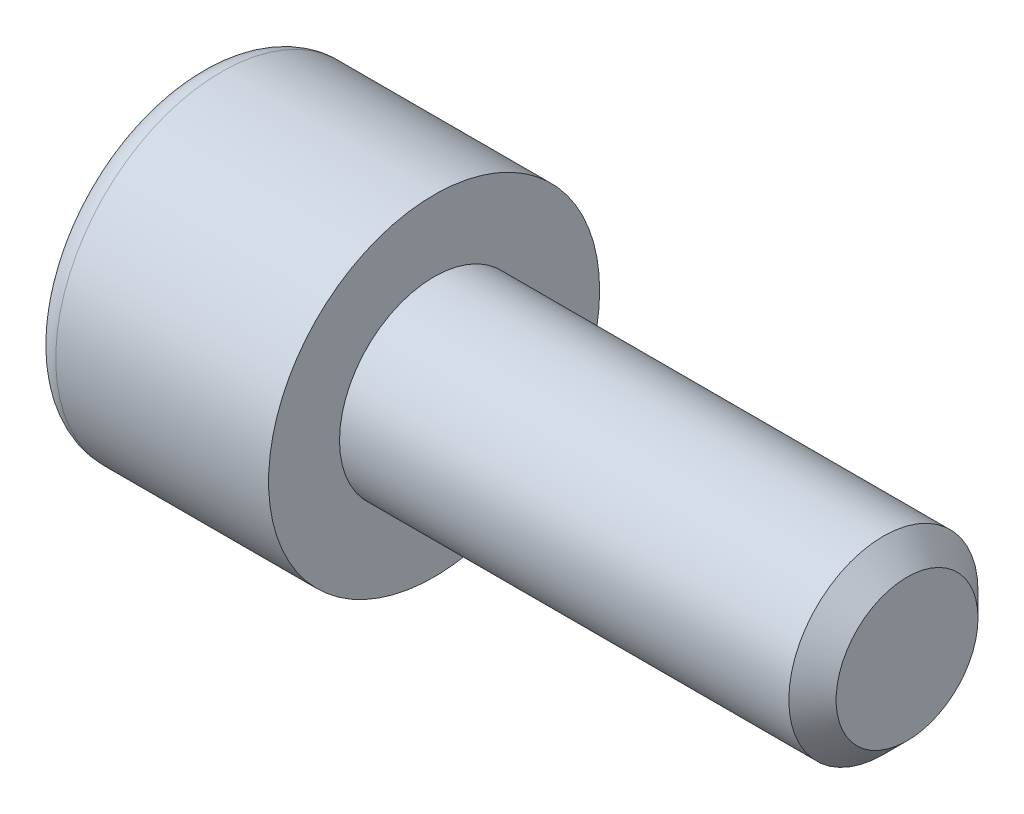
ISO-10303-21;
HEADER;
FILE_DESCRIPTION(('STEP AP214'),'2;1');
FILE_NAME('part.step','',(''),(''),'','','');
FILE_SCHEMA(('AUTOMOTIVE_DESIGN { 1 0 10303 214 1 1 1 1 }'));
ENDSEC;
DATA;
#1=APPLICATION_CONTEXT('core data for automotive mechanical design processes');
#2=APPLICATION_PROTOCOL_DEFINITION('international standard','automotive_design',2000,#1);
#3=PRODUCT_CONTEXT('',#1,'mechanical');
#4=PRODUCT('Part','Part','',(#3));
#5=PRODUCT_RELATED_PRODUCT_CATEGORY('part','',(#4));
#6=PRODUCT_DEFINITION_FORMATION('','',#4);
#7=PRODUCT_DEFINITION_CONTEXT('part definition',#1,'design');
#8=PRODUCT_DEFINITION('design','',#6,#7);
#9=PRODUCT_DEFINITION_SHAPE('','',#8);
#10=(LENGTH_UNIT() NAMED_UNIT(*) SI_UNIT(.MILLI.,.METRE.));
#11=(NAMED_UNIT(*) PLANE_ANGLE_UNIT() SI_UNIT($,.RADIAN.));
#12=(NAMED_UNIT(*) SI_UNIT($,.STERADIAN.) SOLID_ANGLE_UNIT());
#13=UNCERTAINTY_MEASURE_WITH_UNIT(LENGTH_MEASURE(1.E-05),#10,'distance_accuracy_value','');
#14=(GEOMETRIC_REPRESENTATION_CONTEXT(3) GLOBAL_UNCERTAINTY_ASSIGNED_CONTEXT((#13)) GLOBAL_UNIT_ASSIGNED_CONTEXT((#10,
#11,#12)) REPRESENTATION_CONTEXT('',''));
#15=CARTESIAN_POINT('',(0.,0.,0.));
#16=DIRECTION('',(0.,0.,1.));
#17=DIRECTION('',(1.,0.,0.));
#18=AXIS2_PLACEMENT_3D('',#15,#16,#17);
#19=CARTESIAN_POINT('',(5.,0.,0.));
#20=DIRECTION('',(1.,0.,0.));
#21=DIRECTION('',(0.,0.,-1.));
#22=AXIS2_PLACEMENT_3D('',#19,#20,#21);
#23=PLANE('',#22);
#24=CARTESIAN_POINT('',(5.,0.,0.));
#25=DIRECTION('',(1.,0.,0.));
#26=DIRECTION('',(0.,0.,-1.));
#27=AXIS2_PLACEMENT_3D('',#24,#25,#26);
#28=CIRCLE('',#27,3.5);
#29=CARTESIAN_POINT('',(5.,0.,-3.5));
#30=VERTEX_POINT('',#29);
#31=EDGE_CURVE('E144',#30,#30,#28,.T.);
#32=ORIENTED_EDGE('',*,*,#31,.T.);
#33=EDGE_LOOP('',(#32));
#34=FACE_BOUND('',#33,.T.);
#35=CARTESIAN_POINT('',(5.,0.,0.));
#36=DIRECTION('',(1.,0.,0.));
#37=DIRECTION('',(0.,0.,-1.));
#38=AXIS2_PLACEMENT_3D('',#35,#36,#37);
#39=CIRCLE('',#38,2.);
#40=CARTESIAN_POINT('',(5.,0.,-2.));
#41=VERTEX_POINT('',#40);
#42=EDGE_CURVE('E135',#41,#41,#39,.T.);
#43=ORIENTED_EDGE('',*,*,#42,.F.);
#44=EDGE_LOOP('',(#43));
#45=FACE_BOUND('',#44,.T.);
#46=ADVANCED_FACE('F29',(#34,#45),#23,.T.);
#47=CARTESIAN_POINT('',(5.,0.,0.));
#48=DIRECTION('',(-1.,0.,0.));
#49=DIRECTION('',(0.,0.,1.));
#50=AXIS2_PLACEMENT_3D('',#47,#48,#49);
#51=CYLINDRICAL_SURFACE('',#50,3.5);
#52=CARTESIAN_POINT('',(0.5,0.,0.));
#53=DIRECTION('',(1.,0.,0.));
#54=DIRECTION('',(0.,0.,-1.));
#55=AXIS2_PLACEMENT_3D('',#52,#53,#54);
#56=CIRCLE('',#55,3.5);
#57=CARTESIAN_POINT('',(0.5,0.,-3.5));
#58=VERTEX_POINT('',#57);
#59=EDGE_CURVE('E37',#58,#58,#56,.T.);
#60=ORIENTED_EDGE('',*,*,#59,.T.);
#61=EDGE_LOOP('',(#60));
#62=FACE_BOUND('',#61,.T.);
#63=ORIENTED_EDGE('',*,*,#31,.F.);
#64=EDGE_LOOP('',(#63));
#65=FACE_BOUND('',#64,.T.);
#66=ADVANCED_FACE('F31',(#62,#65),#51,.T.);
#67=CARTESIAN_POINT('',(0.,0.,0.));
#68=DIRECTION('',(1.,0.,0.));
#69=DIRECTION('',(0.,0.,-1.));
#70=AXIS2_PLACEMENT_3D('',#67,#68,#69);
#71=PLANE('',#70);
#72=CARTESIAN_POINT('',(0.,0.,0.));
#73=DIRECTION('',(1.,0.,0.));
#74=DIRECTION('',(0.,0.,-1.));
#75=AXIS2_PLACEMENT_3D('',#72,#73,#74);
#76=CIRCLE('',#75,3.);
#77=CARTESIAN_POINT('',(0.,0.,-3.));
#78=VERTEX_POINT('',#77);
#79=EDGE_CURVE('E11',#78,#78,#76,.F.);
#80=ORIENTED_EDGE('',*,*,#79,.T.);
#81=EDGE_LOOP('',(#80));
#82=FACE_BOUND('',#81,.T.);
#83=DIRECTION('',(0.,-0.499999999999998,-0.86602540378444));
#84=VECTOR('',#83,1.);
#85=CARTESIAN_POINT('',(0.,1.73205080756888,0.));
#86=LINE('',#85,#84);
#87=CARTESIAN_POINT('',(0.,1.73205080756888,0.));
#88=VERTEX_POINT('',#87);
#89=CARTESIAN_POINT('',(0.,0.866025403784449,-1.5));
#90=VERTEX_POINT('',#89);
#91=EDGE_CURVE('E111',#88,#90,#86,.T.);
#92=ORIENTED_EDGE('',*,*,#91,.F.);
#93=DIRECTION('',(0.,0.499999999999998,-0.866025403784439));
#94=VECTOR('',#93,1.);
#95=CARTESIAN_POINT('',(0.,0.866025403784447,1.5));
#96=LINE('',#95,#94);
#97=CARTESIAN_POINT('',(0.,0.866025403784447,1.5));
#98=VERTEX_POINT('',#97);
#99=EDGE_CURVE('E117',#98,#88,#96,.T.);
#100=ORIENTED_EDGE('',*,*,#99,.F.);
#101=DIRECTION('',(0.,1.,0.));
#102=VECTOR('',#101,1.);
#103=CARTESIAN_POINT('',(0.,-0.866025403784447,1.5));
#104=LINE('',#103,#102);
#105=CARTESIAN_POINT('',(0.,-0.866025403784447,1.5));
#106=VERTEX_POINT('',#105);
#107=EDGE_CURVE('E130',#106,#98,#104,.T.);
#108=ORIENTED_EDGE('',*,*,#107,.F.);
#109=DIRECTION('',(0.,0.499999999999998,0.866025403784439));
#110=VECTOR('',#109,1.);
#111=CARTESIAN_POINT('',(0.,-1.73205080756888,0.));
#112=LINE('',#111,#110);
#113=CARTESIAN_POINT('',(0.,-1.73205080756888,0.));
#114=VERTEX_POINT('',#113);
#115=EDGE_CURVE('E124',#114,#106,#112,.T.);
#116=ORIENTED_EDGE('',*,*,#115,.F.);
#117=DIRECTION('',(0.,-0.499999999999998,0.86602540378444));
#118=VECTOR('',#117,1.);
#119=CARTESIAN_POINT('',(0.,-0.866025403784449,-1.5));
#120=LINE('',#119,#118);
#121=CARTESIAN_POINT('',(0.,-0.866025403784449,-1.5));
#122=VERTEX_POINT('',#121);
#123=EDGE_CURVE('E122',#122,#114,#120,.T.);
#124=ORIENTED_EDGE('',*,*,#123,.F.);
#125=DIRECTION('',(0.,-1.,0.));
#126=VECTOR('',#125,1.);
#127=CARTESIAN_POINT('',(0.,0.866025403784449,-1.5));
#128=LINE('',#127,#126);
#129=EDGE_CURVE('E103',#90,#122,#128,.T.);
#130=ORIENTED_EDGE('',*,*,#129,.F.);
#131=EDGE_LOOP('',(#92,#100,#108,#116,#124,#130));
#132=FACE_BOUND('',#131,.T.);
#133=ADVANCED_FACE('F119',(#82,#132),#71,.F.);
#134=CARTESIAN_POINT('',(15.,0.,0.));
#135=DIRECTION('',(-1.,0.,0.));
#136=DIRECTION('',(0.,0.,1.));
#137=AXIS2_PLACEMENT_3D('',#134,#135,#136);
#138=CYLINDRICAL_SURFACE('',#137,2.);
#139=CARTESIAN_POINT('',(14.5,0.,0.));
#140=DIRECTION('',(1.,0.,0.));
#141=DIRECTION('',(0.,0.,-1.));
#142=AXIS2_PLACEMENT_3D('',#139,#140,#141);
#143=CIRCLE('',#142,2.);
#144=CARTESIAN_POINT('',(14.5,0.,-2.));
#145=VERTEX_POINT('',#144);
#146=EDGE_CURVE('E150',#145,#145,#143,.F.);
#147=ORIENTED_EDGE('',*,*,#146,.T.);
#148=EDGE_LOOP('',(#147));
#149=FACE_BOUND('',#148,.T.);
#150=ORIENTED_EDGE('',*,*,#42,.T.);
#151=EDGE_LOOP('',(#150));
#152=FACE_BOUND('',#151,.T.);
#153=ADVANCED_FACE('F203',(#149,#152),#138,.T.);
#154=CARTESIAN_POINT('',(15.,0.,0.));
#155=DIRECTION('',(1.,0.,0.));
#156=DIRECTION('',(0.,0.,-1.));
#157=AXIS2_PLACEMENT_3D('',#154,#155,#156);
#158=PLANE('',#157);
#159=CARTESIAN_POINT('',(15.,0.,0.));
#160=DIRECTION('',(1.,0.,0.));
#161=DIRECTION('',(0.,0.,-1.));
#162=AXIS2_PLACEMENT_3D('',#159,#160,#161);
#163=CIRCLE('',#162,1.5);
#164=CARTESIAN_POINT('',(15.,0.,-1.5));
#165=VERTEX_POINT('',#164);
#166=EDGE_CURVE('E147',#165,#165,#163,.T.);
#167=ORIENTED_EDGE('',*,*,#166,.T.);
#168=EDGE_LOOP('',(#167));
#169=FACE_BOUND('',#168,.T.);
#170=ADVANCED_FACE('F206',(#169),#158,.T.);
#171=CARTESIAN_POINT('',(15.,0.,0.));
#172=DIRECTION('',(-1.,0.,0.));
#173=DIRECTION('',(0.,0.,1.));
#174=AXIS2_PLACEMENT_3D('',#171,#172,#173);
#175=CONICAL_SURFACE('',#174,1.5,0.785398163397445);
#176=ORIENTED_EDGE('',*,*,#146,.F.);
#177=EDGE_LOOP('',(#176));
#178=FACE_BOUND('',#177,.T.);
#179=ORIENTED_EDGE('',*,*,#166,.F.);
#180=EDGE_LOOP('',(#179));
#181=FACE_BOUND('',#180,.T.);
#182=ADVANCED_FACE('F210',(#178,#181),#175,.T.);
#183=CARTESIAN_POINT('',(4.,0.866025403784447,1.5));
#184=DIRECTION('',(0.,0.86602540378444,0.499999999999998));
#185=DIRECTION('',(0.,-0.499999999999998,0.86602540378444));
#186=AXIS2_PLACEMENT_3D('',#183,#184,#185);
#187=PLANE('',#186);
#188=DIRECTION('',(-1.,0.,0.));
#189=VECTOR('',#188,1.);
#190=CARTESIAN_POINT('',(4.,1.73205080756888,0.));
#191=LINE('',#190,#189);
#192=CARTESIAN_POINT('',(3.,1.73205080756888,0.));
#193=VERTEX_POINT('',#192);
#194=EDGE_CURVE('E108',#193,#88,#191,.T.);
#195=ORIENTED_EDGE('',*,*,#194,.F.);
#196=DIRECTION('',(0.,0.499999999999998,-0.86602540378444));
#197=VECTOR('',#196,1.);
#198=CARTESIAN_POINT('',(3.,0.866025403784447,1.5));
#199=LINE('',#198,#197);
#200=CARTESIAN_POINT('',(3.,0.866025403784447,1.5));
#201=VERTEX_POINT('',#200);
#202=EDGE_CURVE('E166',#193,#201,#199,.F.);
#203=ORIENTED_EDGE('',*,*,#202,.T.);
#204=DIRECTION('',(-1.,0.,0.));
#205=VECTOR('',#204,1.);
#206=CARTESIAN_POINT('',(4.,0.866025403784447,1.5));
#207=LINE('',#206,#205);
#208=EDGE_CURVE('E133',#201,#98,#207,.T.);
#209=ORIENTED_EDGE('',*,*,#208,.T.);
#210=ORIENTED_EDGE('',*,*,#99,.T.);
#211=EDGE_LOOP('',(#195,#203,#209,#210));
#212=FACE_BOUND('',#211,.T.);
#213=ADVANCED_FACE('F214',(#212),#187,.F.);
#214=CARTESIAN_POINT('',(4.,-0.866025403784447,1.5));
#215=DIRECTION('',(0.,0.,1.));
#216=DIRECTION('',(1.,0.,0.));
#217=AXIS2_PLACEMENT_3D('',#214,#215,#216);
#218=PLANE('',#217);
#219=ORIENTED_EDGE('',*,*,#208,.F.);
#220=DIRECTION('',(0.,1.,0.));
#221=VECTOR('',#220,1.);
#222=CARTESIAN_POINT('',(3.,-0.866025403784447,1.5));
#223=LINE('',#222,#221);
#224=CARTESIAN_POINT('',(3.,-0.866025403784447,1.5));
#225=VERTEX_POINT('',#224);
#226=EDGE_CURVE('E169',#201,#225,#223,.F.);
#227=ORIENTED_EDGE('',*,*,#226,.T.);
#228=DIRECTION('',(-1.,0.,0.));
#229=VECTOR('',#228,1.);
#230=CARTESIAN_POINT('',(4.,-0.866025403784447,1.5));
#231=LINE('',#230,#229);
#232=EDGE_CURVE('E136',#225,#106,#231,.T.);
#233=ORIENTED_EDGE('',*,*,#232,.T.);
#234=ORIENTED_EDGE('',*,*,#107,.T.);
#235=EDGE_LOOP('',(#219,#227,#233,#234));
#236=FACE_BOUND('',#235,.T.);
#237=ADVANCED_FACE('F218',(#236),#218,.F.);
#238=CARTESIAN_POINT('',(4.,-1.73205080756888,0.));
#239=DIRECTION('',(0.,-0.86602540378444,0.499999999999998));
#240=DIRECTION('',(0.,-0.499999999999998,-0.86602540378444));
#241=AXIS2_PLACEMENT_3D('',#238,#239,#240);
#242=PLANE('',#241);
#243=ORIENTED_EDGE('',*,*,#232,.F.);
#244=DIRECTION('',(0.,0.499999999999998,0.86602540378444));
#245=VECTOR('',#244,1.);
#246=CARTESIAN_POINT('',(3.,-1.73205080756888,0.));
#247=LINE('',#246,#245);
#248=CARTESIAN_POINT('',(3.,-1.73205080756888,0.));
#249=VERTEX_POINT('',#248);
#250=EDGE_CURVE('E171',#225,#249,#247,.F.);
#251=ORIENTED_EDGE('',*,*,#250,.T.);
#252=DIRECTION('',(-1.,0.,0.));
#253=VECTOR('',#252,1.);
#254=CARTESIAN_POINT('',(4.,-1.73205080756888,0.));
#255=LINE('',#254,#253);
#256=EDGE_CURVE('E138',#249,#114,#255,.T.);
#257=ORIENTED_EDGE('',*,*,#256,.T.);
#258=ORIENTED_EDGE('',*,*,#115,.T.);
#259=EDGE_LOOP('',(#243,#251,#257,#258));
#260=FACE_BOUND('',#259,.T.);
#261=ADVANCED_FACE('F228',(#260),#242,.F.);
#262=CARTESIAN_POINT('',(4.,-0.866025403784449,-1.5));
#263=DIRECTION('',(0.,-0.86602540378444,-0.499999999999998));
#264=DIRECTION('',(0.,0.499999999999998,-0.86602540378444));
#265=AXIS2_PLACEMENT_3D('',#262,#263,#264);
#266=PLANE('',#265);
#267=ORIENTED_EDGE('',*,*,#256,.F.);
#268=DIRECTION('',(0.,-0.499999999999998,0.86602540378444));
#269=VECTOR('',#268,1.);
#270=CARTESIAN_POINT('',(3.,-0.866025403784449,-1.5));
#271=LINE('',#270,#269);
#272=CARTESIAN_POINT('',(3.,-0.866025403784449,-1.5));
#273=VERTEX_POINT('',#272);
#274=EDGE_CURVE('E52',#249,#273,#271,.F.);
#275=ORIENTED_EDGE('',*,*,#274,.T.);
#276=DIRECTION('',(-1.,0.,0.));
#277=VECTOR('',#276,1.);
#278=CARTESIAN_POINT('',(4.,-0.866025403784449,-1.5));
#279=LINE('',#278,#277);
#280=EDGE_CURVE('E107',#273,#122,#279,.T.);
#281=ORIENTED_EDGE('',*,*,#280,.T.);
#282=ORIENTED_EDGE('',*,*,#123,.T.);
#283=EDGE_LOOP('',(#267,#275,#281,#282));
#284=FACE_BOUND('',#283,.T.);
#285=ADVANCED_FACE('F225',(#284),#266,.F.);
#286=CARTESIAN_POINT('',(4.,0.866025403784449,-1.5));
#287=DIRECTION('',(0.,0.,-1.));
#288=DIRECTION('',(-1.,0.,0.));
#289=AXIS2_PLACEMENT_3D('',#286,#287,#288);
#290=PLANE('',#289);
#291=ORIENTED_EDGE('',*,*,#280,.F.);
#292=DIRECTION('',(0.,-1.,0.));
#293=VECTOR('',#292,1.);
#294=CARTESIAN_POINT('',(3.,0.866025403784449,-1.5));
#295=LINE('',#294,#293);
#296=CARTESIAN_POINT('',(3.,0.866025403784449,-1.5));
#297=VERTEX_POINT('',#296);
#298=EDGE_CURVE('E44',#273,#297,#295,.F.);
#299=ORIENTED_EDGE('',*,*,#298,.T.);
#300=DIRECTION('',(-1.,0.,0.));
#301=VECTOR('',#300,1.);
#302=CARTESIAN_POINT('',(4.,0.866025403784449,-1.5));
#303=LINE('',#302,#301);
#304=EDGE_CURVE('E99',#297,#90,#303,.T.);
#305=ORIENTED_EDGE('',*,*,#304,.T.);
#306=ORIENTED_EDGE('',*,*,#129,.T.);
#307=EDGE_LOOP('',(#291,#299,#305,#306));
#308=FACE_BOUND('',#307,.T.);
#309=ADVANCED_FACE('F101',(#308),#290,.F.);
#310=CARTESIAN_POINT('',(4.,1.73205080756888,0.));
#311=DIRECTION('',(0.,0.86602540378444,-0.499999999999998));
#312=DIRECTION('',(0.,0.499999999999998,0.86602540378444));
#313=AXIS2_PLACEMENT_3D('',#310,#311,#312);
#314=PLANE('',#313);
#315=ORIENTED_EDGE('',*,*,#304,.F.);
#316=DIRECTION('',(0.,-0.499999999999998,-0.86602540378444));
#317=VECTOR('',#316,1.);
#318=CARTESIAN_POINT('',(3.,1.73205080756888,0.));
#319=LINE('',#318,#317);
#320=EDGE_CURVE('E175',#297,#193,#319,.F.);
#321=ORIENTED_EDGE('',*,*,#320,.T.);
#322=ORIENTED_EDGE('',*,*,#194,.T.);
#323=ORIENTED_EDGE('',*,*,#91,.T.);
#324=EDGE_LOOP('',(#315,#321,#322,#323));
#325=FACE_BOUND('',#324,.T.);
#326=ADVANCED_FACE('F112',(#325),#314,.F.);
#327=CARTESIAN_POINT('',(4.,2.59807621135332,-1.5));
#328=DIRECTION('',(-1.,0.,0.));
#329=DIRECTION('',(0.,0.,1.));
#330=AXIS2_PLACEMENT_3D('',#327,#328,#329);
#331=PLANE('',#330);
#332=DIRECTION('',(0.,1.,0.));
#333=VECTOR('',#332,1.);
#334=CARTESIAN_POINT('',(4.,2.59807621135332,0.5));
#335=LINE('',#334,#333);
#336=CARTESIAN_POINT('',(4.,-0.288675134594819,0.5));
#337=VERTEX_POINT('',#336);
#338=CARTESIAN_POINT('',(4.,0.28867513459482,0.5));
#339=VERTEX_POINT('',#338);
#340=EDGE_CURVE('E161',#337,#339,#335,.T.);
#341=ORIENTED_EDGE('',*,*,#340,.T.);
#342=DIRECTION('',(0.,0.499999999999998,-0.86602540378444));
#343=VECTOR('',#342,1.);
#344=CARTESIAN_POINT('',(4.,1.73205080756888,-2.));
#345=LINE('',#344,#343);
#346=CARTESIAN_POINT('',(4.,0.577350269189632,0.));
#347=VERTEX_POINT('',#346);
#348=EDGE_CURVE('E163',#339,#347,#345,.T.);
#349=ORIENTED_EDGE('',*,*,#348,.T.);
#350=DIRECTION('',(0.,-0.499999999999998,-0.86602540378444));
#351=VECTOR('',#350,1.);
#352=CARTESIAN_POINT('',(4.,0.433012701892222,-0.250000000000008));
#353=LINE('',#352,#351);
#354=CARTESIAN_POINT('',(4.,0.288675134594821,-0.5));
#355=VERTEX_POINT('',#354);
#356=EDGE_CURVE('E153',#347,#355,#353,.T.);
#357=ORIENTED_EDGE('',*,*,#356,.T.);
#358=DIRECTION('',(0.,-1.,0.));
#359=VECTOR('',#358,1.);
#360=CARTESIAN_POINT('',(4.,2.59807621135332,-0.5));
#361=LINE('',#360,#359);
#362=CARTESIAN_POINT('',(4.,-0.288675134594821,-0.5));
#363=VERTEX_POINT('',#362);
#364=EDGE_CURVE('E155',#355,#363,#361,.T.);
#365=ORIENTED_EDGE('',*,*,#364,.T.);
#366=DIRECTION('',(0.,-0.499999999999998,0.86602540378444));
#367=VECTOR('',#366,1.);
#368=CARTESIAN_POINT('',(4.,0.866025403784425,-2.5));
#369=LINE('',#368,#367);
#370=CARTESIAN_POINT('',(4.,-0.577350269189632,0.));
#371=VERTEX_POINT('',#370);
#372=EDGE_CURVE('E157',#363,#371,#369,.T.);
#373=ORIENTED_EDGE('',*,*,#372,.T.);
#374=DIRECTION('',(0.,0.499999999999998,0.86602540378444));
#375=VECTOR('',#374,1.);
#376=CARTESIAN_POINT('',(4.,-0.433012701892227,0.249999999999997));
#377=LINE('',#376,#375);
#378=EDGE_CURVE('E159',#371,#337,#377,.T.);
#379=ORIENTED_EDGE('',*,*,#378,.T.);
#380=EDGE_LOOP('',(#341,#349,#357,#365,#373,#379));
#381=FACE_BOUND('',#380,.T.);
#382=ADVANCED_FACE('F222',(#381),#331,.T.);
#383=CARTESIAN_POINT('',(3.,0.866025403784425,-2.5));
#384=DIRECTION('',(0.,-0.499999999999998,0.86602540378444));
#385=DIRECTION('',(0.,-0.86602540378444,-0.499999999999998));
#386=AXIS2_PLACEMENT_3D('',#383,#384,#385);
#387=CYLINDRICAL_SURFACE('',#386,1.);
#388=CARTESIAN_POINT('',(3.,-0.288675134594821,-0.5));
#389=DIRECTION('',(0.,-0.866025403784438,0.500000000000001));
#390=DIRECTION('',(0.,0.500000000000001,0.866025403784438));
#391=AXIS2_PLACEMENT_3D('',#388,#389,#390);
#392=ELLIPSE('',#391,1.15470053837925,1.);
#393=EDGE_CURVE('E268',#273,#363,#392,.T.);
#394=ORIENTED_EDGE('',*,*,#393,.F.);
#395=ORIENTED_EDGE('',*,*,#274,.F.);
#396=CARTESIAN_POINT('',(3.,-0.577350269189632,0.));
#397=DIRECTION('',(0.,0.,1.));
#398=DIRECTION('',(0.,1.,0.));
#399=AXIS2_PLACEMENT_3D('',#396,#397,#398);
#400=ELLIPSE('',#399,1.15470053837925,1.);
#401=EDGE_CURVE('E276',#371,#249,#400,.F.);
#402=ORIENTED_EDGE('',*,*,#401,.F.);
#403=ORIENTED_EDGE('',*,*,#372,.F.);
#404=EDGE_LOOP('',(#394,#395,#402,#403));
#405=FACE_BOUND('',#404,.T.);
#406=ADVANCED_FACE('F237',(#405),#387,.F.);
#407=CARTESIAN_POINT('',(3.,-0.433012701892227,0.249999999999997));
#408=DIRECTION('',(0.,0.499999999999998,0.86602540378444));
#409=DIRECTION('',(0.,-0.86602540378444,0.499999999999998));
#410=AXIS2_PLACEMENT_3D('',#407,#408,#409);
#411=CYLINDRICAL_SURFACE('',#410,1.);
#412=ORIENTED_EDGE('',*,*,#401,.T.);
#413=ORIENTED_EDGE('',*,*,#250,.F.);
#414=CARTESIAN_POINT('',(3.,-0.288675134594819,0.500000000000001));
#415=DIRECTION('',(0.,0.866025403784438,0.500000000000001));
#416=DIRECTION('',(0.,0.500000000000001,-0.866025403784438));
#417=AXIS2_PLACEMENT_3D('',#414,#415,#416);
#418=ELLIPSE('',#417,1.15470053837925,1.);
#419=EDGE_CURVE('E264',#337,#225,#418,.F.);
#420=ORIENTED_EDGE('',*,*,#419,.F.);
#421=ORIENTED_EDGE('',*,*,#378,.F.);
#422=EDGE_LOOP('',(#412,#413,#420,#421));
#423=FACE_BOUND('',#422,.T.);
#424=ADVANCED_FACE('F241',(#423),#411,.F.);
#425=CARTESIAN_POINT('',(3.,2.59807621135332,-0.5));
#426=DIRECTION('',(0.,-1.,0.));
#427=DIRECTION('',(0.,0.,-1.));
#428=AXIS2_PLACEMENT_3D('',#425,#426,#427);
#429=CYLINDRICAL_SURFACE('',#428,1.);
#430=ORIENTED_EDGE('',*,*,#393,.T.);
#431=ORIENTED_EDGE('',*,*,#364,.F.);
#432=CARTESIAN_POINT('',(3.,0.288675134594822,-0.499999999999999));
#433=DIRECTION('',(0.,-0.866025403784438,-0.500000000000001));
#434=DIRECTION('',(0.,-0.500000000000001,0.866025403784438));
#435=AXIS2_PLACEMENT_3D('',#432,#433,#434);
#436=ELLIPSE('',#435,1.15470053837925,1.);
#437=EDGE_CURVE('E261',#297,#355,#436,.T.);
#438=ORIENTED_EDGE('',*,*,#437,.F.);
#439=ORIENTED_EDGE('',*,*,#298,.F.);
#440=EDGE_LOOP('',(#430,#431,#438,#439));
#441=FACE_BOUND('',#440,.T.);
#442=ADVANCED_FACE('F245',(#441),#429,.F.);
#443=CARTESIAN_POINT('',(3.,2.59807621135332,0.5));
#444=DIRECTION('',(0.,1.,0.));
#445=DIRECTION('',(0.,0.,1.));
#446=AXIS2_PLACEMENT_3D('',#443,#444,#445);
#447=CYLINDRICAL_SURFACE('',#446,1.);
#448=ORIENTED_EDGE('',*,*,#419,.T.);
#449=ORIENTED_EDGE('',*,*,#226,.F.);
#450=CARTESIAN_POINT('',(3.,0.28867513459482,0.5));
#451=DIRECTION('',(0.,0.866025403784438,-0.500000000000001));
#452=DIRECTION('',(0.,-0.500000000000001,-0.866025403784438));
#453=AXIS2_PLACEMENT_3D('',#450,#451,#452);
#454=ELLIPSE('',#453,1.15470053837925,1.);
#455=EDGE_CURVE('E265',#339,#201,#454,.F.);
#456=ORIENTED_EDGE('',*,*,#455,.F.);
#457=ORIENTED_EDGE('',*,*,#340,.F.);
#458=EDGE_LOOP('',(#448,#449,#456,#457));
#459=FACE_BOUND('',#458,.T.);
#460=ADVANCED_FACE('F249',(#459),#447,.F.);
#461=CARTESIAN_POINT('',(3.,0.433012701892222,-0.250000000000008));
#462=DIRECTION('',(0.,-0.499999999999998,-0.86602540378444));
#463=DIRECTION('',(0.,0.86602540378444,-0.499999999999998));
#464=AXIS2_PLACEMENT_3D('',#461,#462,#463);
#465=CYLINDRICAL_SURFACE('',#464,1.);
#466=ORIENTED_EDGE('',*,*,#437,.T.);
#467=ORIENTED_EDGE('',*,*,#356,.F.);
#468=CARTESIAN_POINT('',(3.,0.577350269189632,0.));
#469=DIRECTION('',(0.,0.,-1.));
#470=DIRECTION('',(0.,1.,0.));
#471=AXIS2_PLACEMENT_3D('',#468,#469,#470);
#472=ELLIPSE('',#471,1.15470053837925,1.);
#473=EDGE_CURVE('E270',#193,#347,#472,.T.);
#474=ORIENTED_EDGE('',*,*,#473,.F.);
#475=ORIENTED_EDGE('',*,*,#320,.F.);
#476=EDGE_LOOP('',(#466,#467,#474,#475));
#477=FACE_BOUND('',#476,.T.);
#478=ADVANCED_FACE('F190',(#477),#465,.F.);
#479=CARTESIAN_POINT('',(3.,1.73205080756888,-2.));
#480=DIRECTION('',(0.,0.499999999999998,-0.86602540378444));
#481=DIRECTION('',(0.,0.86602540378444,0.499999999999998));
#482=AXIS2_PLACEMENT_3D('',#479,#480,#481);
#483=CYLINDRICAL_SURFACE('',#482,1.);
#484=ORIENTED_EDGE('',*,*,#455,.T.);
#485=ORIENTED_EDGE('',*,*,#202,.F.);
#486=ORIENTED_EDGE('',*,*,#473,.T.);
#487=ORIENTED_EDGE('',*,*,#348,.F.);
#488=EDGE_LOOP('',(#484,#485,#486,#487));
#489=FACE_BOUND('',#488,.T.);
#490=ADVANCED_FACE('F183',(#489),#483,.F.);
#491=CARTESIAN_POINT('',(0.5,0.,0.));
#492=DIRECTION('',(1.,0.,0.));
#493=DIRECTION('',(0.,0.,-1.));
#494=AXIS2_PLACEMENT_3D('',#491,#492,#493);
#495=TOROIDAL_SURFACE('',#494,3.,0.5);
#496=ORIENTED_EDGE('',*,*,#79,.F.);
#497=EDGE_LOOP('',(#496));
#498=FACE_BOUND('',#497,.T.);
#499=ORIENTED_EDGE('',*,*,#59,.F.);
#500=EDGE_LOOP('',(#499));
#501=FACE_BOUND('',#500,.T.);
#502=ADVANCED_FACE('F181',(#498,#501),#495,.T.);
#503=CLOSED_SHELL('',(#46,#66,#133,#153,#170,#182,#213,#237,#261,#285,#309,#326,#382,#406,#424,
#442,#460,#478,#490,#502));
#504=MANIFOLD_SOLID_BREP('B2',#503);
#505=ADVANCED_BREP_SHAPE_REPRESENTATION('',(#18,#504),#14);
#506=SHAPE_DEFINITION_REPRESENTATION(#9,#505);
ENDSEC;
END-ISO-10303-21;
